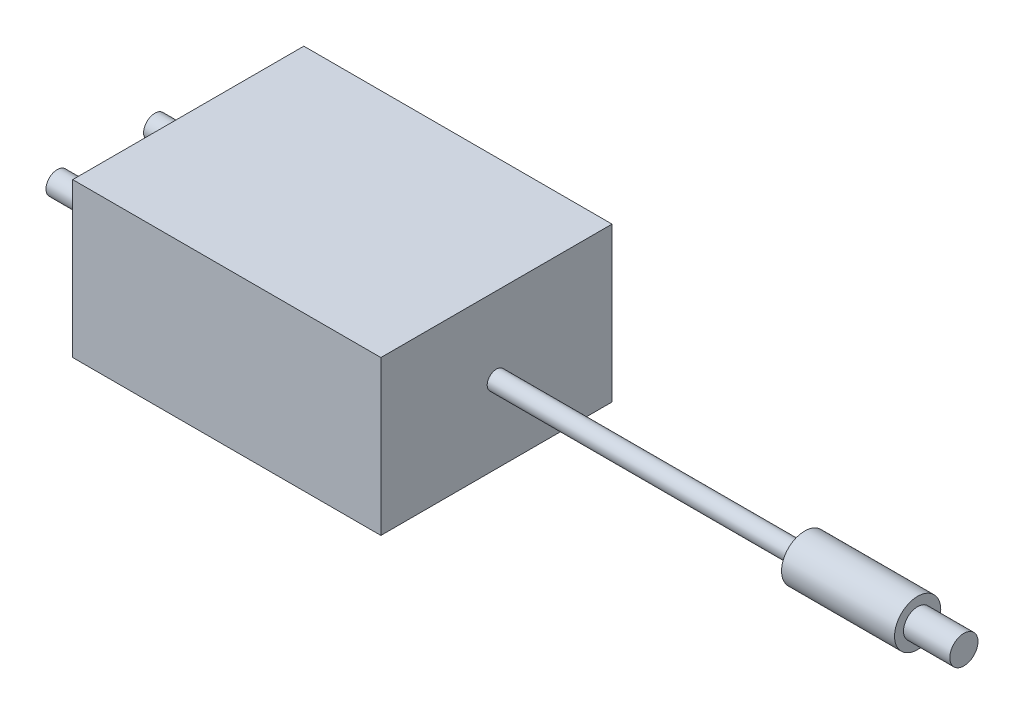
ISO-10303-21;
HEADER;
FILE_DESCRIPTION(('STEP AP214'),'2;1');
FILE_NAME('part.step','',(''),(''),'','','');
FILE_SCHEMA(('AUTOMOTIVE_DESIGN { 1 0 10303 214 1 1 1 1 }'));
ENDSEC;
DATA;
#1=APPLICATION_CONTEXT('core data for automotive mechanical design processes');
#2=APPLICATION_PROTOCOL_DEFINITION('international standard','automotive_design',2000,#1);
#3=PRODUCT_CONTEXT('',#1,'mechanical');
#4=PRODUCT('Part','Part','',(#3));
#5=PRODUCT_RELATED_PRODUCT_CATEGORY('part','',(#4));
#6=PRODUCT_DEFINITION_FORMATION('','',#4);
#7=PRODUCT_DEFINITION_CONTEXT('part definition',#1,'design');
#8=PRODUCT_DEFINITION('design','',#6,#7);
#9=PRODUCT_DEFINITION_SHAPE('','',#8);
#10=(LENGTH_UNIT() NAMED_UNIT(*) SI_UNIT(.MILLI.,.METRE.));
#11=(NAMED_UNIT(*) PLANE_ANGLE_UNIT() SI_UNIT($,.RADIAN.));
#12=(NAMED_UNIT(*) SI_UNIT($,.STERADIAN.) SOLID_ANGLE_UNIT());
#13=UNCERTAINTY_MEASURE_WITH_UNIT(LENGTH_MEASURE(1.E-05),#10,'distance_accuracy_value','');
#14=(GEOMETRIC_REPRESENTATION_CONTEXT(3) GLOBAL_UNCERTAINTY_ASSIGNED_CONTEXT((#13)) GLOBAL_UNIT_ASSIGNED_CONTEXT((#10,
#11,#12)) REPRESENTATION_CONTEXT('',''));
#15=CARTESIAN_POINT('',(0.,0.,0.));
#16=DIRECTION('',(0.,0.,1.));
#17=DIRECTION('',(1.,0.,0.));
#18=AXIS2_PLACEMENT_3D('',#15,#16,#17);
#19=CARTESIAN_POINT('',(151.,15.,-22.5));
#20=DIRECTION('',(-1.,0.,0.));
#21=DIRECTION('',(0.,0.,1.));
#22=AXIS2_PLACEMENT_3D('',#19,#20,#21);
#23=CYLINDRICAL_SURFACE('',#22,2.75);
#24=CARTESIAN_POINT('',(151.,15.,-22.5));
#25=DIRECTION('',(1.,0.,0.));
#26=DIRECTION('',(0.,0.,-1.));
#27=AXIS2_PLACEMENT_3D('',#24,#25,#26);
#28=CIRCLE('',#27,2.75);
#29=CARTESIAN_POINT('',(151.,15.,-25.25));
#30=VERTEX_POINT('',#29);
#31=EDGE_CURVE('E11',#30,#30,#28,.T.);
#32=ORIENTED_EDGE('',*,*,#31,.F.);
#33=EDGE_LOOP('',(#32));
#34=FACE_BOUND('',#33,.T.);
#35=CARTESIAN_POINT('',(142.,15.,-22.5));
#36=DIRECTION('',(1.,0.,0.));
#37=DIRECTION('',(0.,0.,-1.));
#38=AXIS2_PLACEMENT_3D('',#35,#36,#37);
#39=CIRCLE('',#38,2.75);
#40=CARTESIAN_POINT('',(142.,15.,-25.25));
#41=VERTEX_POINT('',#40);
#42=EDGE_CURVE('E60',#41,#41,#39,.T.);
#43=ORIENTED_EDGE('',*,*,#42,.T.);
#44=EDGE_LOOP('',(#43));
#45=FACE_BOUND('',#44,.T.);
#46=ADVANCED_FACE('F53',(#34,#45),#23,.T.);
#47=CARTESIAN_POINT('',(151.,15.,-22.5));
#48=DIRECTION('',(1.,0.,0.));
#49=DIRECTION('',(0.,0.,-1.));
#50=AXIS2_PLACEMENT_3D('',#47,#48,#49);
#51=PLANE('',#50);
#52=ORIENTED_EDGE('',*,*,#31,.T.);
#53=EDGE_LOOP('',(#52));
#54=FACE_BOUND('',#53,.T.);
#55=ADVANCED_FACE('F68',(#54),#51,.T.);
#56=CARTESIAN_POINT('',(142.,15.,-22.5));
#57=DIRECTION('',(1.,0.,0.));
#58=DIRECTION('',(0.,0.,-1.));
#59=AXIS2_PLACEMENT_3D('',#56,#57,#58);
#60=PLANE('',#59);
#61=ORIENTED_EDGE('',*,*,#42,.F.);
#62=EDGE_LOOP('',(#61));
#63=FACE_BOUND('',#62,.T.);
#64=ADVANCED_FACE('F67',(#63),#60,.F.);
#65=CLOSED_SHELL('',(#46,#55,#64));
#66=MANIFOLD_SOLID_BREP('B2',#65);
#67=CARTESIAN_POINT('',(142.,15.,-22.5));
#68=DIRECTION('',(-1.,0.,0.));
#69=DIRECTION('',(0.,0.,1.));
#70=AXIS2_PLACEMENT_3D('',#67,#68,#69);
#71=CYLINDRICAL_SURFACE('',#70,4.5);
#72=CARTESIAN_POINT('',(142.,15.,-22.5));
#73=DIRECTION('',(1.,0.,0.));
#74=DIRECTION('',(0.,0.,-1.));
#75=AXIS2_PLACEMENT_3D('',#72,#73,#74);
#76=CIRCLE('',#75,4.5);
#77=CARTESIAN_POINT('',(142.,15.,-27.));
#78=VERTEX_POINT('',#77);
#79=EDGE_CURVE('E52',#78,#78,#76,.T.);
#80=ORIENTED_EDGE('',*,*,#79,.F.);
#81=EDGE_LOOP('',(#80));
#82=FACE_BOUND('',#81,.T.);
#83=CARTESIAN_POINT('',(120.,15.,-22.5));
#84=DIRECTION('',(1.,0.,0.));
#85=DIRECTION('',(0.,0.,-1.));
#86=AXIS2_PLACEMENT_3D('',#83,#84,#85);
#87=CIRCLE('',#86,4.5);
#88=CARTESIAN_POINT('',(120.,15.,-27.));
#89=VERTEX_POINT('',#88);
#90=EDGE_CURVE('E120',#89,#89,#87,.T.);
#91=ORIENTED_EDGE('',*,*,#90,.T.);
#92=EDGE_LOOP('',(#91));
#93=FACE_BOUND('',#92,.T.);
#94=ADVANCED_FACE('F113',(#82,#93),#71,.T.);
#95=CARTESIAN_POINT('',(142.,15.,-22.5));
#96=DIRECTION('',(1.,0.,0.));
#97=DIRECTION('',(0.,0.,-1.));
#98=AXIS2_PLACEMENT_3D('',#95,#96,#97);
#99=PLANE('',#98);
#100=ORIENTED_EDGE('',*,*,#79,.T.);
#101=EDGE_LOOP('',(#100));
#102=FACE_BOUND('',#101,.T.);
#103=ADVANCED_FACE('F128',(#102),#99,.T.);
#104=CARTESIAN_POINT('',(120.,15.,-22.5));
#105=DIRECTION('',(1.,0.,0.));
#106=DIRECTION('',(0.,0.,-1.));
#107=AXIS2_PLACEMENT_3D('',#104,#105,#106);
#108=PLANE('',#107);
#109=ORIENTED_EDGE('',*,*,#90,.F.);
#110=EDGE_LOOP('',(#109));
#111=FACE_BOUND('',#110,.T.);
#112=ADVANCED_FACE('F126',(#111),#108,.F.);
#113=CLOSED_SHELL('',(#94,#103,#112));
#114=MANIFOLD_SOLID_BREP('B6',#113);
#115=CARTESIAN_POINT('',(120.,15.,-22.5));
#116=DIRECTION('',(-1.,0.,0.));
#117=DIRECTION('',(0.,0.,1.));
#118=AXIS2_PLACEMENT_3D('',#115,#116,#117);
#119=CYLINDRICAL_SURFACE('',#118,1.8);
#120=CARTESIAN_POINT('',(120.,15.,-22.5));
#121=DIRECTION('',(1.,0.,0.));
#122=DIRECTION('',(0.,0.,-1.));
#123=AXIS2_PLACEMENT_3D('',#120,#121,#122);
#124=CIRCLE('',#123,1.8);
#125=CARTESIAN_POINT('',(120.,15.,-24.3));
#126=VERTEX_POINT('',#125);
#127=EDGE_CURVE('E111',#126,#126,#124,.T.);
#128=ORIENTED_EDGE('',*,*,#127,.F.);
#129=EDGE_LOOP('',(#128));
#130=FACE_BOUND('',#129,.T.);
#131=CARTESIAN_POINT('',(60.,15.,-22.5));
#132=DIRECTION('',(1.,0.,0.));
#133=DIRECTION('',(0.,0.,-1.));
#134=AXIS2_PLACEMENT_3D('',#131,#132,#133);
#135=CIRCLE('',#134,1.8);
#136=CARTESIAN_POINT('',(60.,15.,-24.3));
#137=VERTEX_POINT('',#136);
#138=EDGE_CURVE('E178',#137,#137,#135,.T.);
#139=ORIENTED_EDGE('',*,*,#138,.T.);
#140=EDGE_LOOP('',(#139));
#141=FACE_BOUND('',#140,.T.);
#142=ADVANCED_FACE('F176',(#130,#141),#119,.T.);
#143=CARTESIAN_POINT('',(120.,15.,-22.5));
#144=DIRECTION('',(1.,0.,0.));
#145=DIRECTION('',(0.,0.,-1.));
#146=AXIS2_PLACEMENT_3D('',#143,#144,#145);
#147=PLANE('',#146);
#148=ORIENTED_EDGE('',*,*,#127,.T.);
#149=EDGE_LOOP('',(#148));
#150=FACE_BOUND('',#149,.T.);
#151=ADVANCED_FACE('F191',(#150),#147,.T.);
#152=CARTESIAN_POINT('',(60.,15.,-22.5));
#153=DIRECTION('',(1.,0.,0.));
#154=DIRECTION('',(0.,0.,-1.));
#155=AXIS2_PLACEMENT_3D('',#152,#153,#154);
#156=PLANE('',#155);
#157=ORIENTED_EDGE('',*,*,#138,.F.);
#158=EDGE_LOOP('',(#157));
#159=FACE_BOUND('',#158,.T.);
#160=ADVANCED_FACE('F188',(#159),#156,.F.);
#161=CLOSED_SHELL('',(#142,#151,#160));
#162=MANIFOLD_SOLID_BREP('B48',#161);
#163=CARTESIAN_POINT('',(0.,15.,-32.));
#164=DIRECTION('',(-1.,0.,0.));
#165=DIRECTION('',(0.,0.,1.));
#166=AXIS2_PLACEMENT_3D('',#163,#164,#165);
#167=CYLINDRICAL_SURFACE('',#166,2.2);
#168=CARTESIAN_POINT('',(0.,15.,-32.));
#169=DIRECTION('',(1.,0.,0.));
#170=DIRECTION('',(0.,0.,-1.));
#171=AXIS2_PLACEMENT_3D('',#168,#169,#170);
#172=CIRCLE('',#171,2.2);
#173=CARTESIAN_POINT('',(0.,15.,-34.2));
#174=VERTEX_POINT('',#173);
#175=EDGE_CURVE('E244',#174,#174,#172,.T.);
#176=ORIENTED_EDGE('',*,*,#175,.F.);
#177=EDGE_LOOP('',(#176));
#178=FACE_BOUND('',#177,.T.);
#179=CARTESIAN_POINT('',(-16.,15.,-32.));
#180=DIRECTION('',(1.,0.,0.));
#181=DIRECTION('',(0.,0.,-1.));
#182=AXIS2_PLACEMENT_3D('',#179,#180,#181);
#183=CIRCLE('',#182,2.2);
#184=CARTESIAN_POINT('',(-16.,15.,-34.2));
#185=VERTEX_POINT('',#184);
#186=EDGE_CURVE('E172',#185,#185,#183,.T.);
#187=ORIENTED_EDGE('',*,*,#186,.T.);
#188=EDGE_LOOP('',(#187));
#189=FACE_BOUND('',#188,.T.);
#190=ADVANCED_FACE('F240',(#178,#189),#167,.T.);
#191=CARTESIAN_POINT('',(0.,15.,-32.));
#192=DIRECTION('',(1.,0.,0.));
#193=DIRECTION('',(0.,0.,-1.));
#194=AXIS2_PLACEMENT_3D('',#191,#192,#193);
#195=PLANE('',#194);
#196=ORIENTED_EDGE('',*,*,#175,.T.);
#197=EDGE_LOOP('',(#196));
#198=FACE_BOUND('',#197,.T.);
#199=ADVANCED_FACE('F239',(#198),#195,.T.);
#200=CARTESIAN_POINT('',(-16.,15.,-32.));
#201=DIRECTION('',(1.,0.,0.));
#202=DIRECTION('',(0.,0.,-1.));
#203=AXIS2_PLACEMENT_3D('',#200,#201,#202);
#204=PLANE('',#203);
#205=ORIENTED_EDGE('',*,*,#186,.F.);
#206=EDGE_LOOP('',(#205));
#207=FACE_BOUND('',#206,.T.);
#208=ADVANCED_FACE('F258',(#207),#204,.F.);
#209=CLOSED_SHELL('',(#190,#199,#208));
#210=MANIFOLD_SOLID_BREP('B108',#209);
#211=CARTESIAN_POINT('',(0.,15.,-13.));
#212=DIRECTION('',(-1.,0.,0.));
#213=DIRECTION('',(0.,0.,1.));
#214=AXIS2_PLACEMENT_3D('',#211,#212,#213);
#215=CYLINDRICAL_SURFACE('',#214,2.2);
#216=CARTESIAN_POINT('',(0.,15.,-13.));
#217=DIRECTION('',(1.,0.,0.));
#218=DIRECTION('',(0.,0.,-1.));
#219=AXIS2_PLACEMENT_3D('',#216,#217,#218);
#220=CIRCLE('',#219,2.2);
#221=CARTESIAN_POINT('',(0.,15.,-15.2));
#222=VERTEX_POINT('',#221);
#223=EDGE_CURVE('E237',#222,#222,#220,.T.);
#224=ORIENTED_EDGE('',*,*,#223,.F.);
#225=EDGE_LOOP('',(#224));
#226=FACE_BOUND('',#225,.T.);
#227=CARTESIAN_POINT('',(-16.,15.,-13.));
#228=DIRECTION('',(1.,0.,0.));
#229=DIRECTION('',(0.,0.,-1.));
#230=AXIS2_PLACEMENT_3D('',#227,#228,#229);
#231=CIRCLE('',#230,2.2);
#232=CARTESIAN_POINT('',(-16.,15.,-15.2));
#233=VERTEX_POINT('',#232);
#234=EDGE_CURVE('E302',#233,#233,#231,.T.);
#235=ORIENTED_EDGE('',*,*,#234,.T.);
#236=EDGE_LOOP('',(#235));
#237=FACE_BOUND('',#236,.T.);
#238=ADVANCED_FACE('F298',(#226,#237),#215,.T.);
#239=CARTESIAN_POINT('',(0.,15.,-13.));
#240=DIRECTION('',(1.,0.,0.));
#241=DIRECTION('',(0.,0.,-1.));
#242=AXIS2_PLACEMENT_3D('',#239,#240,#241);
#243=PLANE('',#242);
#244=ORIENTED_EDGE('',*,*,#223,.T.);
#245=EDGE_LOOP('',(#244));
#246=FACE_BOUND('',#245,.T.);
#247=ADVANCED_FACE('F314',(#246),#243,.T.);
#248=CARTESIAN_POINT('',(-16.,15.,-13.));
#249=DIRECTION('',(1.,0.,0.));
#250=DIRECTION('',(0.,0.,-1.));
#251=AXIS2_PLACEMENT_3D('',#248,#249,#250);
#252=PLANE('',#251);
#253=ORIENTED_EDGE('',*,*,#234,.F.);
#254=EDGE_LOOP('',(#253));
#255=FACE_BOUND('',#254,.T.);
#256=ADVANCED_FACE('F315',(#255),#252,.F.);
#257=CLOSED_SHELL('',(#238,#247,#256));
#258=MANIFOLD_SOLID_BREP('B168',#257);
#259=CARTESIAN_POINT('',(0.,30.,-45.));
#260=DIRECTION('',(1.,0.,0.));
#261=DIRECTION('',(0.,0.,-1.));
#262=AXIS2_PLACEMENT_3D('',#259,#260,#261);
#263=PLANE('',#262);
#264=DIRECTION('',(0.,0.,1.));
#265=VECTOR('',#264,1.);
#266=CARTESIAN_POINT('',(0.,0.,-45.));
#267=LINE('',#266,#265);
#268=CARTESIAN_POINT('',(0.,0.,-45.));
#269=VERTEX_POINT('',#268);
#270=CARTESIAN_POINT('',(0.,0.,0.));
#271=VERTEX_POINT('',#270);
#272=EDGE_CURVE('E415',#269,#271,#267,.T.);
#273=ORIENTED_EDGE('',*,*,#272,.T.);
#274=DIRECTION('',(0.,-1.,0.));
#275=VECTOR('',#274,1.);
#276=CARTESIAN_POINT('',(0.,30.,0.));
#277=LINE('',#276,#275);
#278=CARTESIAN_POINT('',(0.,30.,0.));
#279=VERTEX_POINT('',#278);
#280=EDGE_CURVE('E296',#279,#271,#277,.T.);
#281=ORIENTED_EDGE('',*,*,#280,.F.);
#282=DIRECTION('',(0.,0.,1.));
#283=VECTOR('',#282,1.);
#284=CARTESIAN_POINT('',(0.,30.,-45.));
#285=LINE('',#284,#283);
#286=CARTESIAN_POINT('',(0.,30.,-45.));
#287=VERTEX_POINT('',#286);
#288=EDGE_CURVE('E401',#287,#279,#285,.T.);
#289=ORIENTED_EDGE('',*,*,#288,.F.);
#290=DIRECTION('',(0.,-1.,0.));
#291=VECTOR('',#290,1.);
#292=CARTESIAN_POINT('',(0.,30.,-45.));
#293=LINE('',#292,#291);
#294=EDGE_CURVE('E411',#287,#269,#293,.T.);
#295=ORIENTED_EDGE('',*,*,#294,.T.);
#296=EDGE_LOOP('',(#273,#281,#289,#295));
#297=FACE_BOUND('',#296,.T.);
#298=ADVANCED_FACE('F351',(#297),#263,.F.);
#299=CARTESIAN_POINT('',(0.,30.,0.));
#300=DIRECTION('',(0.,0.,-1.));
#301=DIRECTION('',(-1.,0.,0.));
#302=AXIS2_PLACEMENT_3D('',#299,#300,#301);
#303=PLANE('',#302);
#304=DIRECTION('',(1.,0.,0.));
#305=VECTOR('',#304,1.);
#306=CARTESIAN_POINT('',(0.,0.,0.));
#307=LINE('',#306,#305);
#308=CARTESIAN_POINT('',(60.,0.,0.));
#309=VERTEX_POINT('',#308);
#310=EDGE_CURVE('E406',#271,#309,#307,.T.);
#311=ORIENTED_EDGE('',*,*,#310,.T.);
#312=DIRECTION('',(0.,-1.,0.));
#313=VECTOR('',#312,1.);
#314=CARTESIAN_POINT('',(60.,30.,0.));
#315=LINE('',#314,#313);
#316=CARTESIAN_POINT('',(60.,30.,0.));
#317=VERTEX_POINT('',#316);
#318=EDGE_CURVE('E360',#317,#309,#315,.T.);
#319=ORIENTED_EDGE('',*,*,#318,.F.);
#320=DIRECTION('',(1.,0.,0.));
#321=VECTOR('',#320,1.);
#322=CARTESIAN_POINT('',(0.,30.,0.));
#323=LINE('',#322,#321);
#324=EDGE_CURVE('E399',#279,#317,#323,.T.);
#325=ORIENTED_EDGE('',*,*,#324,.F.);
#326=ORIENTED_EDGE('',*,*,#280,.T.);
#327=EDGE_LOOP('',(#311,#319,#325,#326));
#328=FACE_BOUND('',#327,.T.);
#329=ADVANCED_FACE('F409',(#328),#303,.F.);
#330=CARTESIAN_POINT('',(60.,30.,-45.));
#331=DIRECTION('',(-1.,0.,0.));
#332=DIRECTION('',(0.,0.,1.));
#333=AXIS2_PLACEMENT_3D('',#330,#331,#332);
#334=PLANE('',#333);
#335=DIRECTION('',(0.,0.,-1.));
#336=VECTOR('',#335,1.);
#337=CARTESIAN_POINT('',(60.,0.,-45.));
#338=LINE('',#337,#336);
#339=CARTESIAN_POINT('',(60.,0.,-45.));
#340=VERTEX_POINT('',#339);
#341=EDGE_CURVE('E384',#309,#340,#338,.T.);
#342=ORIENTED_EDGE('',*,*,#341,.T.);
#343=DIRECTION('',(0.,-1.,0.));
#344=VECTOR('',#343,1.);
#345=CARTESIAN_POINT('',(60.,30.,-45.));
#346=LINE('',#345,#344);
#347=CARTESIAN_POINT('',(60.,30.,-45.));
#348=VERTEX_POINT('',#347);
#349=EDGE_CURVE('E410',#348,#340,#346,.T.);
#350=ORIENTED_EDGE('',*,*,#349,.F.);
#351=DIRECTION('',(0.,0.,-1.));
#352=VECTOR('',#351,1.);
#353=CARTESIAN_POINT('',(60.,30.,-45.));
#354=LINE('',#353,#352);
#355=EDGE_CURVE('E402',#317,#348,#354,.T.);
#356=ORIENTED_EDGE('',*,*,#355,.F.);
#357=ORIENTED_EDGE('',*,*,#318,.T.);
#358=EDGE_LOOP('',(#342,#350,#356,#357));
#359=FACE_BOUND('',#358,.T.);
#360=ADVANCED_FACE('F408',(#359),#334,.F.);
#361=CARTESIAN_POINT('',(0.,30.,-45.));
#362=DIRECTION('',(0.,0.,1.));
#363=DIRECTION('',(1.,0.,0.));
#364=AXIS2_PLACEMENT_3D('',#361,#362,#363);
#365=PLANE('',#364);
#366=DIRECTION('',(-1.,0.,0.));
#367=VECTOR('',#366,1.);
#368=CARTESIAN_POINT('',(0.,0.,-45.));
#369=LINE('',#368,#367);
#370=EDGE_CURVE('E394',#340,#269,#369,.T.);
#371=ORIENTED_EDGE('',*,*,#370,.T.);
#372=ORIENTED_EDGE('',*,*,#294,.F.);
#373=DIRECTION('',(-1.,0.,0.));
#374=VECTOR('',#373,1.);
#375=CARTESIAN_POINT('',(0.,30.,-45.));
#376=LINE('',#375,#374);
#377=EDGE_CURVE('E366',#348,#287,#376,.T.);
#378=ORIENTED_EDGE('',*,*,#377,.F.);
#379=ORIENTED_EDGE('',*,*,#349,.T.);
#380=EDGE_LOOP('',(#371,#372,#378,#379));
#381=FACE_BOUND('',#380,.T.);
#382=ADVANCED_FACE('F425',(#381),#365,.F.);
#383=CARTESIAN_POINT('',(0.,30.,0.));
#384=DIRECTION('',(0.,1.,0.));
#385=DIRECTION('',(0.,0.,1.));
#386=AXIS2_PLACEMENT_3D('',#383,#384,#385);
#387=PLANE('',#386);
#388=ORIENTED_EDGE('',*,*,#288,.T.);
#389=ORIENTED_EDGE('',*,*,#324,.T.);
#390=ORIENTED_EDGE('',*,*,#355,.T.);
#391=ORIENTED_EDGE('',*,*,#377,.T.);
#392=EDGE_LOOP('',(#388,#389,#390,#391));
#393=FACE_BOUND('',#392,.T.);
#394=ADVANCED_FACE('F398',(#393),#387,.T.);
#395=CARTESIAN_POINT('',(0.,0.,0.));
#396=DIRECTION('',(0.,1.,0.));
#397=DIRECTION('',(0.,0.,1.));
#398=AXIS2_PLACEMENT_3D('',#395,#396,#397);
#399=PLANE('',#398);
#400=ORIENTED_EDGE('',*,*,#272,.F.);
#401=ORIENTED_EDGE('',*,*,#370,.F.);
#402=ORIENTED_EDGE('',*,*,#341,.F.);
#403=ORIENTED_EDGE('',*,*,#310,.F.);
#404=EDGE_LOOP('',(#400,#401,#402,#403));
#405=FACE_BOUND('',#404,.T.);
#406=ADVANCED_FACE('F422',(#405),#399,.F.);
#407=CLOSED_SHELL('',(#298,#329,#360,#382,#394,#406));
#408=MANIFOLD_SOLID_BREP('B231',#407);
#409=ADVANCED_BREP_SHAPE_REPRESENTATION('',(#18,#66,#114,#162,#210,#258,#408),#14);
#410=SHAPE_DEFINITION_REPRESENTATION(#9,#409);
ENDSEC;
END-ISO-10303-21;
